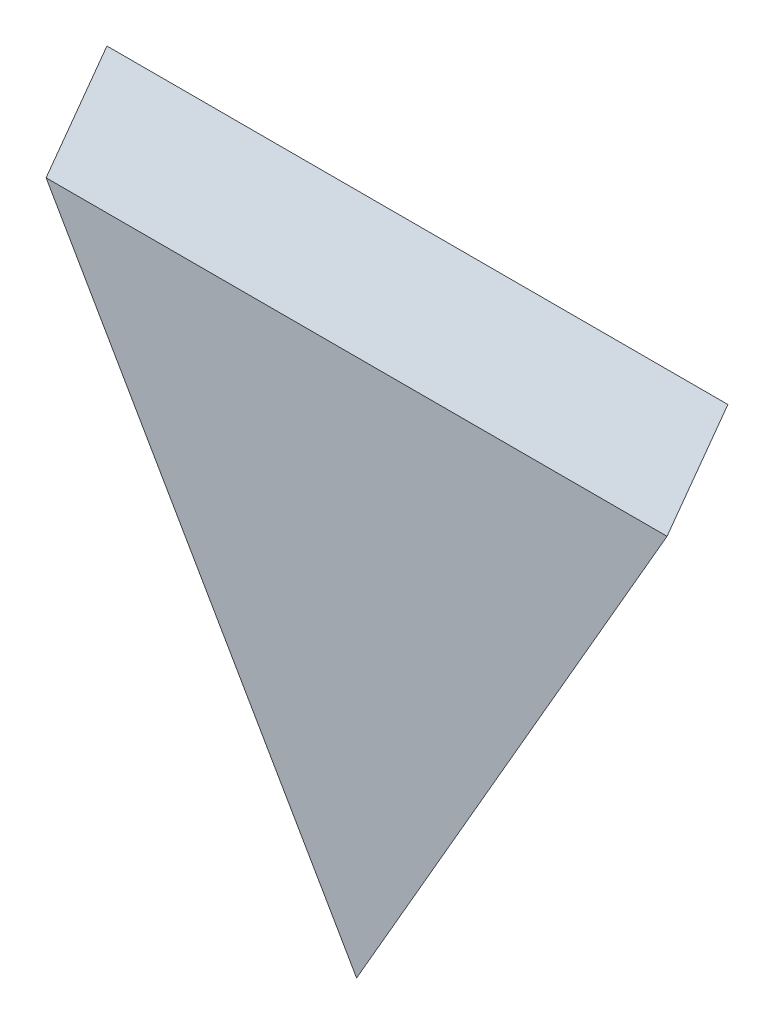
ISO-10303-21;
HEADER;
FILE_DESCRIPTION(('STEP AP214'),'2;1');
FILE_NAME('part.step','',(''),(''),'','','');
FILE_SCHEMA(('AUTOMOTIVE_DESIGN { 1 0 10303 214 1 1 1 1 }'));
ENDSEC;
DATA;
#1=APPLICATION_CONTEXT('core data for automotive mechanical design processes');
#2=APPLICATION_PROTOCOL_DEFINITION('international standard','automotive_design',2000,#1);
#3=PRODUCT_CONTEXT('',#1,'mechanical');
#4=PRODUCT('Part','Part','',(#3));
#5=PRODUCT_RELATED_PRODUCT_CATEGORY('part','',(#4));
#6=PRODUCT_DEFINITION_FORMATION('','',#4);
#7=PRODUCT_DEFINITION_CONTEXT('part definition',#1,'design');
#8=PRODUCT_DEFINITION('design','',#6,#7);
#9=PRODUCT_DEFINITION_SHAPE('','',#8);
#10=(LENGTH_UNIT() NAMED_UNIT(*) SI_UNIT(.MILLI.,.METRE.));
#11=(NAMED_UNIT(*) PLANE_ANGLE_UNIT() SI_UNIT($,.RADIAN.));
#12=(NAMED_UNIT(*) SI_UNIT($,.STERADIAN.) SOLID_ANGLE_UNIT());
#13=UNCERTAINTY_MEASURE_WITH_UNIT(LENGTH_MEASURE(1.E-05),#10,'distance_accuracy_value','');
#14=(GEOMETRIC_REPRESENTATION_CONTEXT(3) GLOBAL_UNCERTAINTY_ASSIGNED_CONTEXT((#13)) GLOBAL_UNIT_ASSIGNED_CONTEXT((#10,
#11,#12)) REPRESENTATION_CONTEXT('',''));
#15=CARTESIAN_POINT('',(0.,0.,0.));
#16=DIRECTION('',(0.,0.,1.));
#17=DIRECTION('',(1.,0.,0.));
#18=AXIS2_PLACEMENT_3D('',#15,#16,#17);
#19=CARTESIAN_POINT('',(0.,0.,0.));
#20=DIRECTION('',(0.,0.,1.));
#21=DIRECTION('',(1.,0.,0.));
#22=AXIS2_PLACEMENT_3D('',#19,#20,#21);
#23=PLANE('',#22);
#24=DIRECTION('',(0.5,-0.866025403784438,0.));
#25=VECTOR('',#24,1.);
#26=CARTESIAN_POINT('',(-38.1,65.9911357683742,0.));
#27=LINE('',#26,#25);
#28=CARTESIAN_POINT('',(-38.1,65.9911357683742,0.));
#29=VERTEX_POINT('',#28);
#30=CARTESIAN_POINT('',(0.,0.,0.));
#31=VERTEX_POINT('',#30);
#32=EDGE_CURVE('E74',#29,#31,#27,.T.);
#33=ORIENTED_EDGE('',*,*,#32,.T.);
#34=DIRECTION('',(0.5,0.866025403784439,0.));
#35=VECTOR('',#34,1.);
#36=CARTESIAN_POINT('',(0.,0.,0.));
#37=LINE('',#36,#35);
#38=CARTESIAN_POINT('',(38.1,65.9911357683742,0.));
#39=VERTEX_POINT('',#38);
#40=EDGE_CURVE('E70',#31,#39,#37,.T.);
#41=ORIENTED_EDGE('',*,*,#40,.T.);
#42=DIRECTION('',(-1.,0.,0.));
#43=VECTOR('',#42,1.);
#44=CARTESIAN_POINT('',(38.1,65.9911357683742,0.));
#45=LINE('',#44,#43);
#46=EDGE_CURVE('E66',#39,#29,#45,.T.);
#47=ORIENTED_EDGE('',*,*,#46,.T.);
#48=EDGE_LOOP('',(#33,#41,#47));
#49=FACE_BOUND('',#48,.T.);
#50=ADVANCED_FACE('F33',(#49),#23,.T.);
#51=CARTESIAN_POINT('',(0.,10.2745158285618,-7.46487270411449));
#52=DIRECTION('',(0.,0.,1.));
#53=DIRECTION('',(1.,0.,0.));
#54=AXIS2_PLACEMENT_3D('',#51,#52,#53);
#55=PLANE('',#54);
#56=DIRECTION('',(0.5,-0.866025403784438,0.));
#57=VECTOR('',#56,1.);
#58=CARTESIAN_POINT('',(-38.1,76.265651596936,-7.46487270411449));
#59=LINE('',#58,#57);
#60=CARTESIAN_POINT('',(-38.1,76.265651596936,-7.46487270411449));
#61=VERTEX_POINT('',#60);
#62=CARTESIAN_POINT('',(0.,10.2745158285618,-7.46487270411449));
#63=VERTEX_POINT('',#62);
#64=EDGE_CURVE('E56',#61,#63,#59,.T.);
#65=ORIENTED_EDGE('',*,*,#64,.F.);
#66=DIRECTION('',(-1.,0.,0.));
#67=VECTOR('',#66,1.);
#68=CARTESIAN_POINT('',(38.1,76.265651596936,-7.46487270411449));
#69=LINE('',#68,#67);
#70=CARTESIAN_POINT('',(38.1,76.265651596936,-7.46487270411449));
#71=VERTEX_POINT('',#70);
#72=EDGE_CURVE('E11',#71,#61,#69,.T.);
#73=ORIENTED_EDGE('',*,*,#72,.F.);
#74=DIRECTION('',(0.5,0.866025403784439,0.));
#75=VECTOR('',#74,1.);
#76=CARTESIAN_POINT('',(0.,10.2745158285618,-7.46487270411449));
#77=LINE('',#76,#75);
#78=EDGE_CURVE('E47',#63,#71,#77,.T.);
#79=ORIENTED_EDGE('',*,*,#78,.F.);
#80=EDGE_LOOP('',(#65,#73,#79));
#81=FACE_BOUND('',#80,.T.);
#82=ADVANCED_FACE('F95',(#81),#55,.F.);
#83=CARTESIAN_POINT('',(-38.1,65.9911357683742,0.));
#84=DIRECTION('',(0.713411036430501,0.411888053926,0.566915270681793));
#85=DIRECTION('',(0.622139854231876,0.,-0.782906125775204));
#86=AXIS2_PLACEMENT_3D('',#83,#84,#85);
#87=PLANE('',#86);
#88=DIRECTION('',(0.,0.809016994374943,-0.58778525229248));
#89=VECTOR('',#88,1.);
#90=CARTESIAN_POINT('',(0.,0.,0.));
#91=LINE('',#90,#89);
#92=EDGE_CURVE('E77',#31,#63,#91,.T.);
#93=ORIENTED_EDGE('',*,*,#92,.F.);
#94=ORIENTED_EDGE('',*,*,#32,.F.);
#95=DIRECTION('',(0.,0.809016994374943,-0.58778525229248));
#96=VECTOR('',#95,1.);
#97=CARTESIAN_POINT('',(-38.1,65.9911357683742,0.));
#98=LINE('',#97,#96);
#99=EDGE_CURVE('E76',#29,#61,#98,.T.);
#100=ORIENTED_EDGE('',*,*,#99,.T.);
#101=ORIENTED_EDGE('',*,*,#64,.T.);
#102=EDGE_LOOP('',(#93,#94,#100,#101));
#103=FACE_BOUND('',#102,.T.);
#104=ADVANCED_FACE('F75',(#103),#87,.F.);
#105=CARTESIAN_POINT('',(0.,0.,0.));
#106=DIRECTION('',(-0.713411036430502,0.411888053926,0.566915270681792));
#107=DIRECTION('',(0.622139854231875,0.,0.782906125775205));
#108=AXIS2_PLACEMENT_3D('',#105,#106,#107);
#109=PLANE('',#108);
#110=DIRECTION('',(0.,0.809016994374943,-0.58778525229248));
#111=VECTOR('',#110,1.);
#112=CARTESIAN_POINT('',(38.1,65.9911357683742,0.));
#113=LINE('',#112,#111);
#114=EDGE_CURVE('E40',#39,#71,#113,.T.);
#115=ORIENTED_EDGE('',*,*,#114,.F.);
#116=ORIENTED_EDGE('',*,*,#40,.F.);
#117=ORIENTED_EDGE('',*,*,#92,.T.);
#118=ORIENTED_EDGE('',*,*,#78,.T.);
#119=EDGE_LOOP('',(#115,#116,#117,#118));
#120=FACE_BOUND('',#119,.T.);
#121=ADVANCED_FACE('F87',(#120),#109,.F.);
#122=CARTESIAN_POINT('',(38.1,65.9911357683742,0.));
#123=DIRECTION('',(0.,-0.58778525229248,-0.809016994374943));
#124=DIRECTION('',(0.,0.809016994374943,-0.58778525229248));
#125=AXIS2_PLACEMENT_3D('',#122,#123,#124);
#126=PLANE('',#125);
#127=ORIENTED_EDGE('',*,*,#72,.T.);
#128=ORIENTED_EDGE('',*,*,#99,.F.);
#129=ORIENTED_EDGE('',*,*,#46,.F.);
#130=ORIENTED_EDGE('',*,*,#114,.T.);
#131=EDGE_LOOP('',(#127,#128,#129,#130));
#132=FACE_BOUND('',#131,.T.);
#133=ADVANCED_FACE('F80',(#132),#126,.F.);
#134=CLOSED_SHELL('',(#50,#82,#104,#121,#133));
#135=MANIFOLD_SOLID_BREP('B2',#134);
#136=ADVANCED_BREP_SHAPE_REPRESENTATION('',(#18,#135),#14);
#137=SHAPE_DEFINITION_REPRESENTATION(#9,#136);
ENDSEC;
END-ISO-10303-21;
